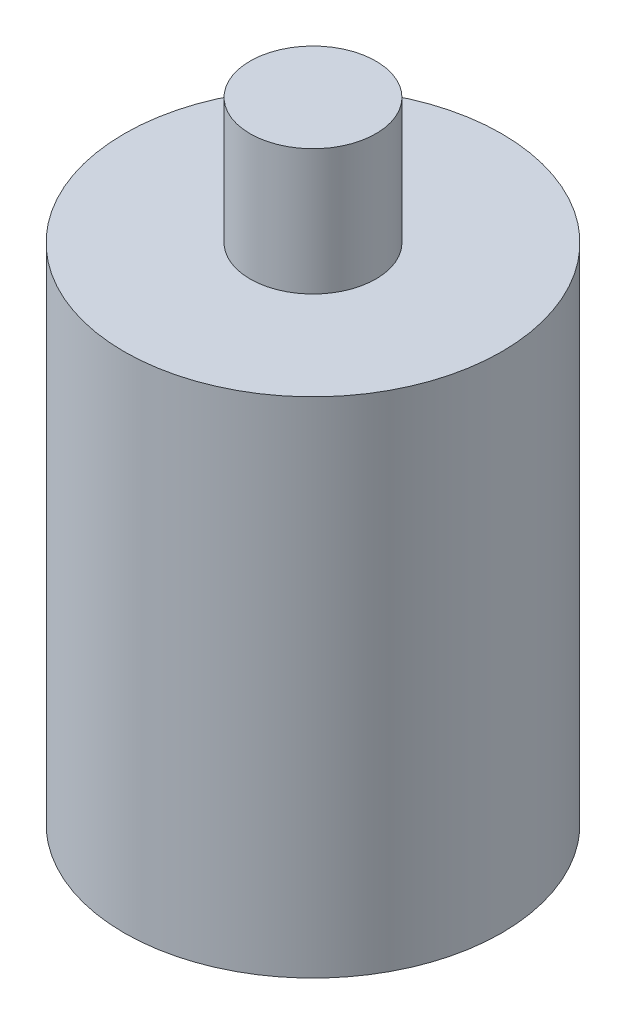
ISO-10303-21;
HEADER;
FILE_DESCRIPTION(('STEP AP214'),'2;1');
FILE_NAME('part.step','',(''),(''),'','','');
FILE_SCHEMA(('AUTOMOTIVE_DESIGN { 1 0 10303 214 1 1 1 1 }'));
ENDSEC;
DATA;
#1=APPLICATION_CONTEXT('core data for automotive mechanical design processes');
#2=APPLICATION_PROTOCOL_DEFINITION('international standard','automotive_design',2000,#1);
#3=PRODUCT_CONTEXT('',#1,'mechanical');
#4=PRODUCT('Part','Part','',(#3));
#5=PRODUCT_RELATED_PRODUCT_CATEGORY('part','',(#4));
#6=PRODUCT_DEFINITION_FORMATION('','',#4);
#7=PRODUCT_DEFINITION_CONTEXT('part definition',#1,'design');
#8=PRODUCT_DEFINITION('design','',#6,#7);
#9=PRODUCT_DEFINITION_SHAPE('','',#8);
#10=(LENGTH_UNIT() NAMED_UNIT(*) SI_UNIT(.MILLI.,.METRE.));
#11=(NAMED_UNIT(*) PLANE_ANGLE_UNIT() SI_UNIT($,.RADIAN.));
#12=(NAMED_UNIT(*) SI_UNIT($,.STERADIAN.) SOLID_ANGLE_UNIT());
#13=UNCERTAINTY_MEASURE_WITH_UNIT(LENGTH_MEASURE(1.E-05),#10,'distance_accuracy_value','');
#14=(GEOMETRIC_REPRESENTATION_CONTEXT(3) GLOBAL_UNCERTAINTY_ASSIGNED_CONTEXT((#13)) GLOBAL_UNIT_ASSIGNED_CONTEXT((#10,
#11,#12)) REPRESENTATION_CONTEXT('',''));
#15=CARTESIAN_POINT('',(0.,0.,0.));
#16=DIRECTION('',(0.,0.,1.));
#17=DIRECTION('',(1.,0.,0.));
#18=AXIS2_PLACEMENT_3D('',#15,#16,#17);
#19=CARTESIAN_POINT('',(0.,101.6,0.));
#20=DIRECTION('',(0.,-1.,0.));
#21=DIRECTION('',(0.,0.,-1.));
#22=AXIS2_PLACEMENT_3D('',#19,#20,#21);
#23=CYLINDRICAL_SURFACE('',#22,38.1);
#24=CARTESIAN_POINT('',(0.,101.6,0.));
#25=DIRECTION('',(0.,1.,0.));
#26=DIRECTION('',(0.,0.,1.));
#27=AXIS2_PLACEMENT_3D('',#24,#25,#26);
#28=CIRCLE('',#27,38.1);
#29=CARTESIAN_POINT('',(0.,101.6,38.1));
#30=VERTEX_POINT('',#29);
#31=EDGE_CURVE('E57',#30,#30,#28,.T.);
#32=ORIENTED_EDGE('',*,*,#31,.F.);
#33=EDGE_LOOP('',(#32));
#34=FACE_BOUND('',#33,.T.);
#35=CARTESIAN_POINT('',(0.,0.,0.));
#36=DIRECTION('',(0.,1.,0.));
#37=DIRECTION('',(0.,0.,1.));
#38=AXIS2_PLACEMENT_3D('',#35,#36,#37);
#39=CIRCLE('',#38,38.1);
#40=CARTESIAN_POINT('',(0.,0.,38.1));
#41=VERTEX_POINT('',#40);
#42=EDGE_CURVE('E52',#41,#41,#39,.T.);
#43=ORIENTED_EDGE('',*,*,#42,.T.);
#44=EDGE_LOOP('',(#43));
#45=FACE_BOUND('',#44,.T.);
#46=ADVANCED_FACE('F49',(#34,#45),#23,.T.);
#47=CARTESIAN_POINT('',(0.,101.6,0.));
#48=DIRECTION('',(0.,1.,0.));
#49=DIRECTION('',(0.,0.,1.));
#50=AXIS2_PLACEMENT_3D('',#47,#48,#49);
#51=PLANE('',#50);
#52=CARTESIAN_POINT('',(0.,101.6,0.));
#53=DIRECTION('',(0.,1.,0.));
#54=DIRECTION('',(0.,0.,1.));
#55=AXIS2_PLACEMENT_3D('',#52,#53,#54);
#56=CIRCLE('',#55,12.7);
#57=CARTESIAN_POINT('',(0.,101.6,12.7));
#58=VERTEX_POINT('',#57);
#59=EDGE_CURVE('E12',#58,#58,#56,.T.);
#60=ORIENTED_EDGE('',*,*,#59,.F.);
#61=EDGE_LOOP('',(#60));
#62=FACE_BOUND('',#61,.T.);
#63=ORIENTED_EDGE('',*,*,#31,.T.);
#64=EDGE_LOOP('',(#63));
#65=FACE_BOUND('',#64,.T.);
#66=ADVANCED_FACE('F77',(#62,#65),#51,.T.);
#67=CARTESIAN_POINT('',(0.,0.,0.));
#68=DIRECTION('',(0.,1.,0.));
#69=DIRECTION('',(0.,0.,1.));
#70=AXIS2_PLACEMENT_3D('',#67,#68,#69);
#71=PLANE('',#70);
#72=ORIENTED_EDGE('',*,*,#42,.F.);
#73=EDGE_LOOP('',(#72));
#74=FACE_BOUND('',#73,.T.);
#75=ADVANCED_FACE('F74',(#74),#71,.F.);
#76=CARTESIAN_POINT('',(0.,127.,0.));
#77=DIRECTION('',(0.,-1.,0.));
#78=DIRECTION('',(0.,0.,-1.));
#79=AXIS2_PLACEMENT_3D('',#76,#77,#78);
#80=CYLINDRICAL_SURFACE('',#79,12.7);
#81=CARTESIAN_POINT('',(0.,127.,0.));
#82=DIRECTION('',(0.,1.,0.));
#83=DIRECTION('',(0.,0.,1.));
#84=AXIS2_PLACEMENT_3D('',#81,#82,#83);
#85=CIRCLE('',#84,12.7);
#86=CARTESIAN_POINT('',(0.,127.,12.7));
#87=VERTEX_POINT('',#86);
#88=EDGE_CURVE('E64',#87,#87,#85,.T.);
#89=ORIENTED_EDGE('',*,*,#88,.F.);
#90=EDGE_LOOP('',(#89));
#91=FACE_BOUND('',#90,.T.);
#92=ORIENTED_EDGE('',*,*,#59,.T.);
#93=EDGE_LOOP('',(#92));
#94=FACE_BOUND('',#93,.T.);
#95=ADVANCED_FACE('F76',(#91,#94),#80,.T.);
#96=CARTESIAN_POINT('',(0.,127.,0.));
#97=DIRECTION('',(0.,1.,0.));
#98=DIRECTION('',(0.,0.,1.));
#99=AXIS2_PLACEMENT_3D('',#96,#97,#98);
#100=PLANE('',#99);
#101=ORIENTED_EDGE('',*,*,#88,.T.);
#102=EDGE_LOOP('',(#101));
#103=FACE_BOUND('',#102,.T.);
#104=ADVANCED_FACE('F82',(#103),#100,.T.);
#105=CLOSED_SHELL('',(#46,#66,#75,#95,#104));
#106=MANIFOLD_SOLID_BREP('B2',#105);
#107=ADVANCED_BREP_SHAPE_REPRESENTATION('',(#18,#106),#14);
#108=SHAPE_DEFINITION_REPRESENTATION(#9,#107);
ENDSEC;
END-ISO-10303-21;
